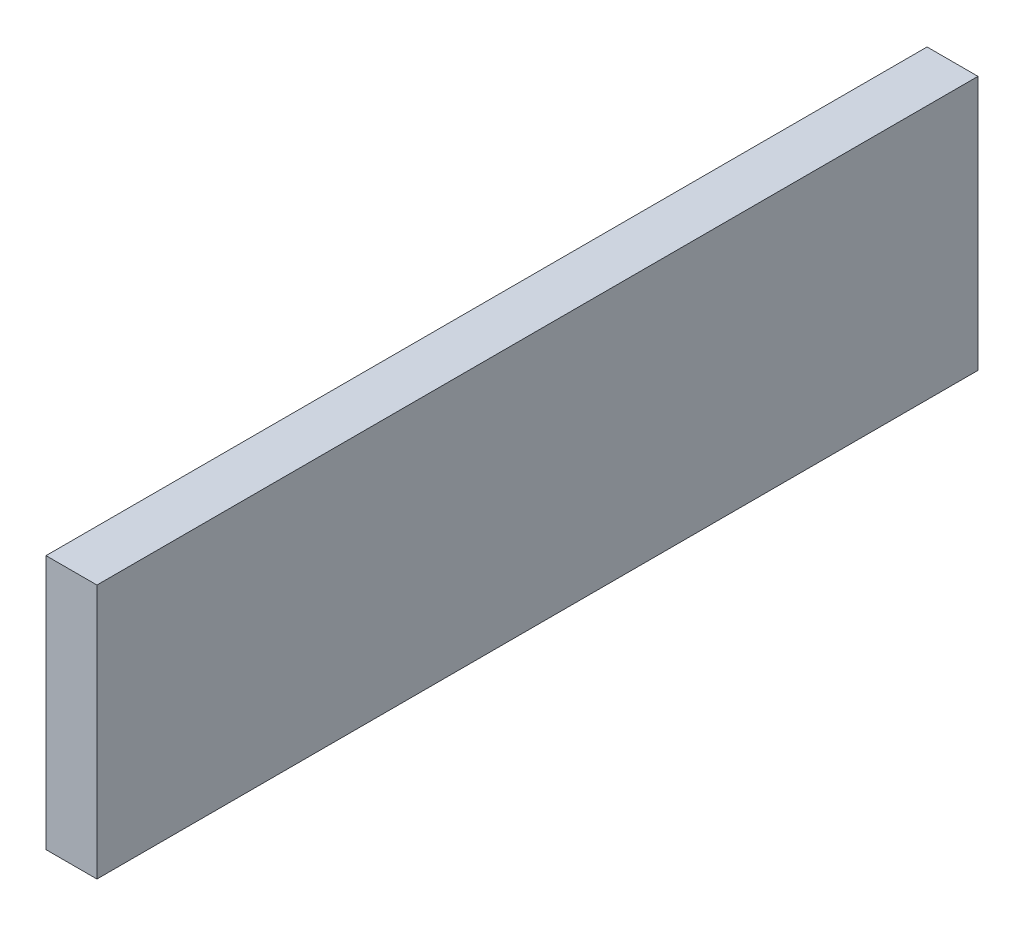
ISO-10303-21;
HEADER;
FILE_DESCRIPTION(('STEP AP214'),'2;1');
FILE_NAME('part.step','',(''),(''),'','','');
FILE_SCHEMA(('AUTOMOTIVE_DESIGN { 1 0 10303 214 1 1 1 1 }'));
ENDSEC;
DATA;
#1=APPLICATION_CONTEXT('core data for automotive mechanical design processes');
#2=APPLICATION_PROTOCOL_DEFINITION('international standard','automotive_design',2000,#1);
#3=PRODUCT_CONTEXT('',#1,'mechanical');
#4=PRODUCT('Part','Part','',(#3));
#5=PRODUCT_RELATED_PRODUCT_CATEGORY('part','',(#4));
#6=PRODUCT_DEFINITION_FORMATION('','',#4);
#7=PRODUCT_DEFINITION_CONTEXT('part definition',#1,'design');
#8=PRODUCT_DEFINITION('design','',#6,#7);
#9=PRODUCT_DEFINITION_SHAPE('','',#8);
#10=(LENGTH_UNIT() NAMED_UNIT(*) SI_UNIT(.MILLI.,.METRE.));
#11=(NAMED_UNIT(*) PLANE_ANGLE_UNIT() SI_UNIT($,.RADIAN.));
#12=(NAMED_UNIT(*) SI_UNIT($,.STERADIAN.) SOLID_ANGLE_UNIT());
#13=UNCERTAINTY_MEASURE_WITH_UNIT(LENGTH_MEASURE(1.E-05),#10,'distance_accuracy_value','');
#14=(GEOMETRIC_REPRESENTATION_CONTEXT(3) GLOBAL_UNCERTAINTY_ASSIGNED_CONTEXT((#13)) GLOBAL_UNIT_ASSIGNED_CONTEXT((#10,
#11,#12)) REPRESENTATION_CONTEXT('',''));
#15=CARTESIAN_POINT('',(0.,0.,0.));
#16=DIRECTION('',(0.,0.,1.));
#17=DIRECTION('',(1.,0.,0.));
#18=AXIS2_PLACEMENT_3D('',#15,#16,#17);
#19=CARTESIAN_POINT('',(0.,100.,0.));
#20=DIRECTION('',(1.,0.,0.));
#21=DIRECTION('',(0.,0.,-1.));
#22=AXIS2_PLACEMENT_3D('',#19,#20,#21);
#23=PLANE('',#22);
#24=DIRECTION('',(0.,0.,1.));
#25=VECTOR('',#24,1.);
#26=CARTESIAN_POINT('',(0.,0.,0.));
#27=LINE('',#26,#25);
#28=CARTESIAN_POINT('',(0.,0.,0.));
#29=VERTEX_POINT('',#28);
#30=CARTESIAN_POINT('',(0.,0.,346.));
#31=VERTEX_POINT('',#30);
#32=EDGE_CURVE('E107',#29,#31,#27,.T.);
#33=ORIENTED_EDGE('',*,*,#32,.T.);
#34=DIRECTION('',(0.,-1.,0.));
#35=VECTOR('',#34,1.);
#36=CARTESIAN_POINT('',(0.,100.,346.));
#37=LINE('',#36,#35);
#38=CARTESIAN_POINT('',(0.,100.,346.));
#39=VERTEX_POINT('',#38);
#40=EDGE_CURVE('E11',#39,#31,#37,.T.);
#41=ORIENTED_EDGE('',*,*,#40,.F.);
#42=DIRECTION('',(0.,0.,1.));
#43=VECTOR('',#42,1.);
#44=CARTESIAN_POINT('',(0.,100.,0.));
#45=LINE('',#44,#43);
#46=CARTESIAN_POINT('',(0.,100.,0.));
#47=VERTEX_POINT('',#46);
#48=EDGE_CURVE('E91',#47,#39,#45,.T.);
#49=ORIENTED_EDGE('',*,*,#48,.F.);
#50=DIRECTION('',(0.,-1.,0.));
#51=VECTOR('',#50,1.);
#52=CARTESIAN_POINT('',(0.,100.,0.));
#53=LINE('',#52,#51);
#54=EDGE_CURVE('E103',#47,#29,#53,.T.);
#55=ORIENTED_EDGE('',*,*,#54,.T.);
#56=EDGE_LOOP('',(#33,#41,#49,#55));
#57=FACE_BOUND('',#56,.T.);
#58=ADVANCED_FACE('F39',(#57),#23,.F.);
#59=CARTESIAN_POINT('',(0.,100.,346.));
#60=DIRECTION('',(0.,0.,-1.));
#61=DIRECTION('',(-1.,0.,0.));
#62=AXIS2_PLACEMENT_3D('',#59,#60,#61);
#63=PLANE('',#62);
#64=DIRECTION('',(1.,0.,0.));
#65=VECTOR('',#64,1.);
#66=CARTESIAN_POINT('',(0.,0.,346.));
#67=LINE('',#66,#65);
#68=CARTESIAN_POINT('',(20.0000000000001,0.,346.));
#69=VERTEX_POINT('',#68);
#70=EDGE_CURVE('E96',#31,#69,#67,.T.);
#71=ORIENTED_EDGE('',*,*,#70,.T.);
#72=DIRECTION('',(0.,-1.,0.));
#73=VECTOR('',#72,1.);
#74=CARTESIAN_POINT('',(20.0000000000001,100.,346.));
#75=LINE('',#74,#73);
#76=CARTESIAN_POINT('',(20.0000000000001,100.,346.));
#77=VERTEX_POINT('',#76);
#78=EDGE_CURVE('E48',#77,#69,#75,.T.);
#79=ORIENTED_EDGE('',*,*,#78,.F.);
#80=DIRECTION('',(1.,0.,0.));
#81=VECTOR('',#80,1.);
#82=CARTESIAN_POINT('',(0.,100.,346.));
#83=LINE('',#82,#81);
#84=EDGE_CURVE('E86',#39,#77,#83,.T.);
#85=ORIENTED_EDGE('',*,*,#84,.F.);
#86=ORIENTED_EDGE('',*,*,#40,.T.);
#87=EDGE_LOOP('',(#71,#79,#85,#86));
#88=FACE_BOUND('',#87,.T.);
#89=ADVANCED_FACE('F95',(#88),#63,.F.);
#90=CARTESIAN_POINT('',(20.,100.,0.));
#91=DIRECTION('',(-1.,0.,0.));
#92=DIRECTION('',(0.,0.,1.));
#93=AXIS2_PLACEMENT_3D('',#90,#91,#92);
#94=PLANE('',#93);
#95=DIRECTION('',(0.,0.,-1.));
#96=VECTOR('',#95,1.);
#97=CARTESIAN_POINT('',(20.,0.,0.));
#98=LINE('',#97,#96);
#99=CARTESIAN_POINT('',(20.,0.,0.));
#100=VERTEX_POINT('',#99);
#101=EDGE_CURVE('E73',#69,#100,#98,.T.);
#102=ORIENTED_EDGE('',*,*,#101,.T.);
#103=DIRECTION('',(0.,-1.,0.));
#104=VECTOR('',#103,1.);
#105=CARTESIAN_POINT('',(20.,100.,0.));
#106=LINE('',#105,#104);
#107=CARTESIAN_POINT('',(20.,100.,0.));
#108=VERTEX_POINT('',#107);
#109=EDGE_CURVE('E98',#108,#100,#106,.T.);
#110=ORIENTED_EDGE('',*,*,#109,.F.);
#111=DIRECTION('',(0.,0.,-1.));
#112=VECTOR('',#111,1.);
#113=CARTESIAN_POINT('',(20.,100.,0.));
#114=LINE('',#113,#112);
#115=EDGE_CURVE('E89',#77,#108,#114,.T.);
#116=ORIENTED_EDGE('',*,*,#115,.F.);
#117=ORIENTED_EDGE('',*,*,#78,.T.);
#118=EDGE_LOOP('',(#102,#110,#116,#117));
#119=FACE_BOUND('',#118,.T.);
#120=ADVANCED_FACE('F99',(#119),#94,.F.);
#121=CARTESIAN_POINT('',(0.,100.,0.));
#122=DIRECTION('',(0.,0.,1.));
#123=DIRECTION('',(1.,0.,0.));
#124=AXIS2_PLACEMENT_3D('',#121,#122,#123);
#125=PLANE('',#124);
#126=DIRECTION('',(-1.,0.,0.));
#127=VECTOR('',#126,1.);
#128=CARTESIAN_POINT('',(0.,0.,0.));
#129=LINE('',#128,#127);
#130=EDGE_CURVE('E79',#100,#29,#129,.T.);
#131=ORIENTED_EDGE('',*,*,#130,.T.);
#132=ORIENTED_EDGE('',*,*,#54,.F.);
#133=DIRECTION('',(-1.,0.,0.));
#134=VECTOR('',#133,1.);
#135=CARTESIAN_POINT('',(0.,100.,0.));
#136=LINE('',#135,#134);
#137=EDGE_CURVE('E56',#108,#47,#136,.T.);
#138=ORIENTED_EDGE('',*,*,#137,.F.);
#139=ORIENTED_EDGE('',*,*,#109,.T.);
#140=EDGE_LOOP('',(#131,#132,#138,#139));
#141=FACE_BOUND('',#140,.T.);
#142=ADVANCED_FACE('F120',(#141),#125,.F.);
#143=CARTESIAN_POINT('',(0.,100.,0.));
#144=DIRECTION('',(0.,1.,0.));
#145=DIRECTION('',(0.,0.,1.));
#146=AXIS2_PLACEMENT_3D('',#143,#144,#145);
#147=PLANE('',#146);
#148=ORIENTED_EDGE('',*,*,#48,.T.);
#149=ORIENTED_EDGE('',*,*,#84,.T.);
#150=ORIENTED_EDGE('',*,*,#115,.T.);
#151=ORIENTED_EDGE('',*,*,#137,.T.);
#152=EDGE_LOOP('',(#148,#149,#150,#151));
#153=FACE_BOUND('',#152,.T.);
#154=ADVANCED_FACE('F87',(#153),#147,.T.);
#155=CARTESIAN_POINT('',(0.,0.,0.));
#156=DIRECTION('',(0.,1.,0.));
#157=DIRECTION('',(0.,0.,1.));
#158=AXIS2_PLACEMENT_3D('',#155,#156,#157);
#159=PLANE('',#158);
#160=ORIENTED_EDGE('',*,*,#32,.F.);
#161=ORIENTED_EDGE('',*,*,#130,.F.);
#162=ORIENTED_EDGE('',*,*,#101,.F.);
#163=ORIENTED_EDGE('',*,*,#70,.F.);
#164=EDGE_LOOP('',(#160,#161,#162,#163));
#165=FACE_BOUND('',#164,.T.);
#166=ADVANCED_FACE('F123',(#165),#159,.F.);
#167=CLOSED_SHELL('',(#58,#89,#120,#142,#154,#166));
#168=MANIFOLD_SOLID_BREP('B2',#167);
#169=ADVANCED_BREP_SHAPE_REPRESENTATION('',(#18,#168),#14);
#170=SHAPE_DEFINITION_REPRESENTATION(#9,#169);
ENDSEC;
END-ISO-10303-21;
